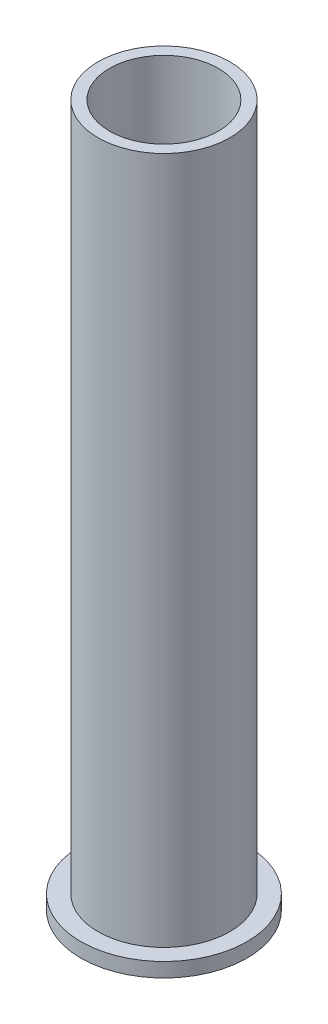
ISO-10303-21;
HEADER;
FILE_DESCRIPTION(('STEP AP214'),'2;1');
FILE_NAME('part.step','',(''),(''),'','','');
FILE_SCHEMA(('AUTOMOTIVE_DESIGN { 1 0 10303 214 1 1 1 1 }'));
ENDSEC;
DATA;
#1=APPLICATION_CONTEXT('core data for automotive mechanical design processes');
#2=APPLICATION_PROTOCOL_DEFINITION('international standard','automotive_design',2000,#1);
#3=PRODUCT_CONTEXT('',#1,'mechanical');
#4=PRODUCT('Part','Part','',(#3));
#5=PRODUCT_RELATED_PRODUCT_CATEGORY('part','',(#4));
#6=PRODUCT_DEFINITION_FORMATION('','',#4);
#7=PRODUCT_DEFINITION_CONTEXT('part definition',#1,'design');
#8=PRODUCT_DEFINITION('design','',#6,#7);
#9=PRODUCT_DEFINITION_SHAPE('','',#8);
#10=(LENGTH_UNIT() NAMED_UNIT(*) SI_UNIT(.MILLI.,.METRE.));
#11=(NAMED_UNIT(*) PLANE_ANGLE_UNIT() SI_UNIT($,.RADIAN.));
#12=(NAMED_UNIT(*) SI_UNIT($,.STERADIAN.) SOLID_ANGLE_UNIT());
#13=UNCERTAINTY_MEASURE_WITH_UNIT(LENGTH_MEASURE(1.E-05),#10,'distance_accuracy_value','');
#14=(GEOMETRIC_REPRESENTATION_CONTEXT(3) GLOBAL_UNCERTAINTY_ASSIGNED_CONTEXT((#13)) GLOBAL_UNIT_ASSIGNED_CONTEXT((#10,
#11,#12)) REPRESENTATION_CONTEXT('',''));
#15=CARTESIAN_POINT('',(0.,0.,0.));
#16=DIRECTION('',(0.,0.,1.));
#17=DIRECTION('',(1.,0.,0.));
#18=AXIS2_PLACEMENT_3D('',#15,#16,#17);
#19=CARTESIAN_POINT('',(0.,3.175,0.));
#20=DIRECTION('',(0.,1.,0.));
#21=DIRECTION('',(0.,0.,1.));
#22=AXIS2_PLACEMENT_3D('',#19,#20,#21);
#23=PLANE('',#22);
#24=CARTESIAN_POINT('',(0.,3.175,0.));
#25=DIRECTION('',(0.,1.,0.));
#26=DIRECTION('',(0.,0.,1.));
#27=AXIS2_PLACEMENT_3D('',#24,#25,#26);
#28=CIRCLE('',#27,18.415);
#29=CARTESIAN_POINT('',(0.,3.175,18.415));
#30=VERTEX_POINT('',#29);
#31=EDGE_CURVE('E10',#30,#30,#28,.T.);
#32=ORIENTED_EDGE('',*,*,#31,.T.);
#33=EDGE_LOOP('',(#32));
#34=FACE_BOUND('',#33,.T.);
#35=CARTESIAN_POINT('',(0.,3.175,0.));
#36=DIRECTION('',(0.,1.,0.));
#37=DIRECTION('',(0.,0.,1.));
#38=AXIS2_PLACEMENT_3D('',#35,#36,#37);
#39=CIRCLE('',#38,14.605);
#40=CARTESIAN_POINT('',(0.,3.17500000000001,-14.605));
#41=VERTEX_POINT('',#40);
#42=EDGE_CURVE('E51',#41,#41,#39,.T.);
#43=ORIENTED_EDGE('',*,*,#42,.F.);
#44=EDGE_LOOP('',(#43));
#45=FACE_BOUND('',#44,.T.);
#46=ADVANCED_FACE('F35',(#34,#45),#23,.T.);
#47=CARTESIAN_POINT('',(0.,0.,0.));
#48=DIRECTION('',(0.,1.,0.));
#49=DIRECTION('',(0.,0.,1.));
#50=AXIS2_PLACEMENT_3D('',#47,#48,#49);
#51=PLANE('',#50);
#52=CARTESIAN_POINT('',(0.,0.,0.));
#53=DIRECTION('',(0.,1.,0.));
#54=DIRECTION('',(0.,0.,1.));
#55=AXIS2_PLACEMENT_3D('',#52,#53,#54);
#56=CIRCLE('',#55,18.415);
#57=CARTESIAN_POINT('',(0.,0.,18.415));
#58=VERTEX_POINT('',#57);
#59=EDGE_CURVE('E39',#58,#58,#56,.T.);
#60=ORIENTED_EDGE('',*,*,#59,.F.);
#61=EDGE_LOOP('',(#60));
#62=FACE_BOUND('',#61,.T.);
#63=CARTESIAN_POINT('',(0.,0.,0.));
#64=DIRECTION('',(0.,1.,0.));
#65=DIRECTION('',(0.,0.,1.));
#66=AXIS2_PLACEMENT_3D('',#63,#64,#65);
#67=CIRCLE('',#66,12.065);
#68=CARTESIAN_POINT('',(0.,0.,12.065));
#69=VERTEX_POINT('',#68);
#70=EDGE_CURVE('E46',#69,#69,#67,.T.);
#71=ORIENTED_EDGE('',*,*,#70,.T.);
#72=EDGE_LOOP('',(#71));
#73=FACE_BOUND('',#72,.T.);
#74=ADVANCED_FACE('F76',(#62,#73),#51,.F.);
#75=CARTESIAN_POINT('',(0.,3.175,0.));
#76=DIRECTION('',(0.,-1.,0.));
#77=DIRECTION('',(0.,0.,-1.));
#78=AXIS2_PLACEMENT_3D('',#75,#76,#77);
#79=CYLINDRICAL_SURFACE('',#78,18.415);
#80=ORIENTED_EDGE('',*,*,#31,.F.);
#81=EDGE_LOOP('',(#80));
#82=FACE_BOUND('',#81,.T.);
#83=ORIENTED_EDGE('',*,*,#59,.T.);
#84=EDGE_LOOP('',(#83));
#85=FACE_BOUND('',#84,.T.);
#86=ADVANCED_FACE('F37',(#82,#85),#79,.T.);
#87=CARTESIAN_POINT('',(0.,3.175,0.));
#88=DIRECTION('',(0.,-1.,0.));
#89=DIRECTION('',(0.,0.,-1.));
#90=AXIS2_PLACEMENT_3D('',#87,#88,#89);
#91=CYLINDRICAL_SURFACE('',#90,12.065);
#92=ORIENTED_EDGE('',*,*,#70,.F.);
#93=EDGE_LOOP('',(#92));
#94=FACE_BOUND('',#93,.T.);
#95=CARTESIAN_POINT('',(0.,155.575,0.));
#96=DIRECTION('',(0.,1.,0.));
#97=DIRECTION('',(0.,0.,1.));
#98=AXIS2_PLACEMENT_3D('',#95,#96,#97);
#99=CIRCLE('',#98,12.065);
#100=CARTESIAN_POINT('',(0.,155.575,12.065));
#101=VERTEX_POINT('',#100);
#102=EDGE_CURVE('E54',#101,#101,#99,.T.);
#103=ORIENTED_EDGE('',*,*,#102,.T.);
#104=EDGE_LOOP('',(#103));
#105=FACE_BOUND('',#104,.T.);
#106=ADVANCED_FACE('F60',(#94,#105),#91,.F.);
#107=CARTESIAN_POINT('',(0.,155.575,0.));
#108=DIRECTION('',(0.,1.,0.));
#109=DIRECTION('',(0.,0.,1.));
#110=AXIS2_PLACEMENT_3D('',#107,#108,#109);
#111=PLANE('',#110);
#112=CARTESIAN_POINT('',(0.,155.575,0.));
#113=DIRECTION('',(0.,1.,0.));
#114=DIRECTION('',(0.,0.,1.));
#115=AXIS2_PLACEMENT_3D('',#112,#113,#114);
#116=CIRCLE('',#115,14.605);
#117=CARTESIAN_POINT('',(0.,155.575,-14.605));
#118=VERTEX_POINT('',#117);
#119=EDGE_CURVE('E50',#118,#118,#116,.T.);
#120=ORIENTED_EDGE('',*,*,#119,.T.);
#121=EDGE_LOOP('',(#120));
#122=FACE_BOUND('',#121,.T.);
#123=ORIENTED_EDGE('',*,*,#102,.F.);
#124=EDGE_LOOP('',(#123));
#125=FACE_BOUND('',#124,.T.);
#126=ADVANCED_FACE('F62',(#122,#125),#111,.T.);
#127=CARTESIAN_POINT('',(0.,155.575,0.));
#128=DIRECTION('',(0.,-1.,0.));
#129=DIRECTION('',(0.,0.,-1.));
#130=AXIS2_PLACEMENT_3D('',#127,#128,#129);
#131=CYLINDRICAL_SURFACE('',#130,14.605);
#132=CARTESIAN_POINT('',(0.,155.575,-14.605));
#133=CARTESIAN_POINT('',(0.,153.9875,-14.605));
#134=CARTESIAN_POINT('',(0.,152.4,-14.605));
#135=CARTESIAN_POINT('',(0.,149.225,-14.605));
#136=CARTESIAN_POINT('',(0.,147.6375,-14.605));
#137=CARTESIAN_POINT('',(0.,144.4625,-14.605));
#138=CARTESIAN_POINT('',(0.,142.875,-14.605));
#139=CARTESIAN_POINT('',(0.,139.7,-14.605));
#140=CARTESIAN_POINT('',(0.,138.1125,-14.605));
#141=CARTESIAN_POINT('',(0.,134.9375,-14.605));
#142=CARTESIAN_POINT('',(0.,133.35,-14.605));
#143=CARTESIAN_POINT('',(0.,130.175,-14.605));
#144=CARTESIAN_POINT('',(0.,128.5875,-14.605));
#145=CARTESIAN_POINT('',(0.,125.4125,-14.605));
#146=CARTESIAN_POINT('',(0.,123.825,-14.605));
#147=CARTESIAN_POINT('',(0.,120.65,-14.605));
#148=CARTESIAN_POINT('',(0.,119.0625,-14.605));
#149=CARTESIAN_POINT('',(0.,115.8875,-14.605));
#150=CARTESIAN_POINT('',(0.,114.3,-14.605));
#151=CARTESIAN_POINT('',(0.,111.125,-14.605));
#152=CARTESIAN_POINT('',(0.,109.5375,-14.605));
#153=CARTESIAN_POINT('',(0.,106.3625,-14.605));
#154=CARTESIAN_POINT('',(0.,104.775,-14.605));
#155=CARTESIAN_POINT('',(0.,101.6,-14.605));
#156=CARTESIAN_POINT('',(0.,100.0125,-14.605));
#157=CARTESIAN_POINT('',(0.,96.8375,-14.605));
#158=CARTESIAN_POINT('',(0.,95.25,-14.605));
#159=CARTESIAN_POINT('',(0.,92.075,-14.605));
#160=CARTESIAN_POINT('',(0.,90.4875,-14.605));
#161=CARTESIAN_POINT('',(0.,87.3125,-14.605));
#162=CARTESIAN_POINT('',(0.,85.725,-14.605));
#163=CARTESIAN_POINT('',(0.,82.55,-14.605));
#164=CARTESIAN_POINT('',(0.,80.9625,-14.605));
#165=CARTESIAN_POINT('',(0.,77.7875,-14.605));
#166=CARTESIAN_POINT('',(0.,76.2,-14.605));
#167=CARTESIAN_POINT('',(0.,73.025,-14.605));
#168=CARTESIAN_POINT('',(0.,71.4375,-14.605));
#169=CARTESIAN_POINT('',(0.,68.2625,-14.605));
#170=CARTESIAN_POINT('',(0.,66.675,-14.605));
#171=CARTESIAN_POINT('',(0.,63.5,-14.605));
#172=CARTESIAN_POINT('',(0.,61.9125,-14.605));
#173=CARTESIAN_POINT('',(0.,58.7375,-14.605));
#174=CARTESIAN_POINT('',(0.,57.15,-14.605));
#175=CARTESIAN_POINT('',(0.,53.975,-14.605));
#176=CARTESIAN_POINT('',(0.,52.3875,-14.605));
#177=CARTESIAN_POINT('',(0.,49.2125,-14.605));
#178=CARTESIAN_POINT('',(0.,47.625,-14.605));
#179=CARTESIAN_POINT('',(0.,44.45,-14.605));
#180=CARTESIAN_POINT('',(0.,42.8625,-14.605));
#181=CARTESIAN_POINT('',(0.,39.6875,-14.605));
#182=CARTESIAN_POINT('',(0.,38.1,-14.605));
#183=CARTESIAN_POINT('',(0.,34.925,-14.605));
#184=CARTESIAN_POINT('',(0.,33.3375,-14.605));
#185=CARTESIAN_POINT('',(0.,30.1625,-14.605));
#186=CARTESIAN_POINT('',(0.,28.575,-14.605));
#187=CARTESIAN_POINT('',(0.,25.4,-14.605));
#188=CARTESIAN_POINT('',(0.,23.8125,-14.605));
#189=CARTESIAN_POINT('',(0.,20.6375,-14.605));
#190=CARTESIAN_POINT('',(0.,19.05,-14.605));
#191=CARTESIAN_POINT('',(0.,15.875,-14.605));
#192=CARTESIAN_POINT('',(0.,14.2875,-14.605));
#193=CARTESIAN_POINT('',(0.,11.1125,-14.605));
#194=CARTESIAN_POINT('',(0.,9.52500000000001,-14.605));
#195=CARTESIAN_POINT('',(0.,6.35000000000001,-14.605));
#196=CARTESIAN_POINT('',(0.,4.76250000000001,-14.605));
#197=CARTESIAN_POINT('',(0.,3.17500000000001,-14.605));
#198=B_SPLINE_CURVE_WITH_KNOTS('',3,(#132,#133,#134,#135,#136,#137,#138,#139,#140,#141,#142,
#143,#144,#145,#146,#147,#148,#149,#150,#151,#152,#153,#154,#155,#156,#157,#158,#159,#160,#161,
#162,#163,#164,#165,#166,#167,#168,#169,#170,#171,#172,#173,#174,#175,#176,#177,#178,#179,#180,
#181,#182,#183,#184,#185,#186,#187,#188,#189,#190,#191,#192,#193,#194,#195,#196,#197),
.UNSPECIFIED.,.F.,.F.,(4,2,2,2,2,2,2,2,2,2,2,2,2,2,2,2,2,2,2,2,2,2,2,2,2,2,2,2,2,2,2,2,4),(0.,
4.7625,9.52500000000001,14.2875,19.05,23.8125,28.575,33.3375,38.1,42.8625,47.625,52.3875,57.15,
61.9125,66.675,71.4375,76.2,80.9625,85.725,90.4875,95.25,100.0125,104.775,109.5375,114.3,
119.0625,123.825,128.5875,133.35,138.1125,142.875,147.6375,152.4),.UNSPECIFIED.);
#199=EDGE_CURVE('BSEAM64',#118,#41,#198,.T.);
#200=ORIENTED_EDGE('',*,*,#119,.F.);
#201=ORIENTED_EDGE('',*,*,#42,.T.);
#202=ORIENTED_EDGE('',*,*,#199,.T.);
#203=ORIENTED_EDGE('',*,*,#199,.F.);
#204=EDGE_LOOP('',(#200,#202,#201,#203));
#205=FACE_BOUND('',#204,.T.);
#206=ADVANCED_FACE('F64',(#205),#131,.T.);
#207=CLOSED_SHELL('',(#46,#74,#86,#106,#126,#206));
#208=MANIFOLD_SOLID_BREP('B2',#207);
#209=ADVANCED_BREP_SHAPE_REPRESENTATION('',(#18,#208),#14);
#210=SHAPE_DEFINITION_REPRESENTATION(#9,#209);
ENDSEC;
END-ISO-10303-21;
